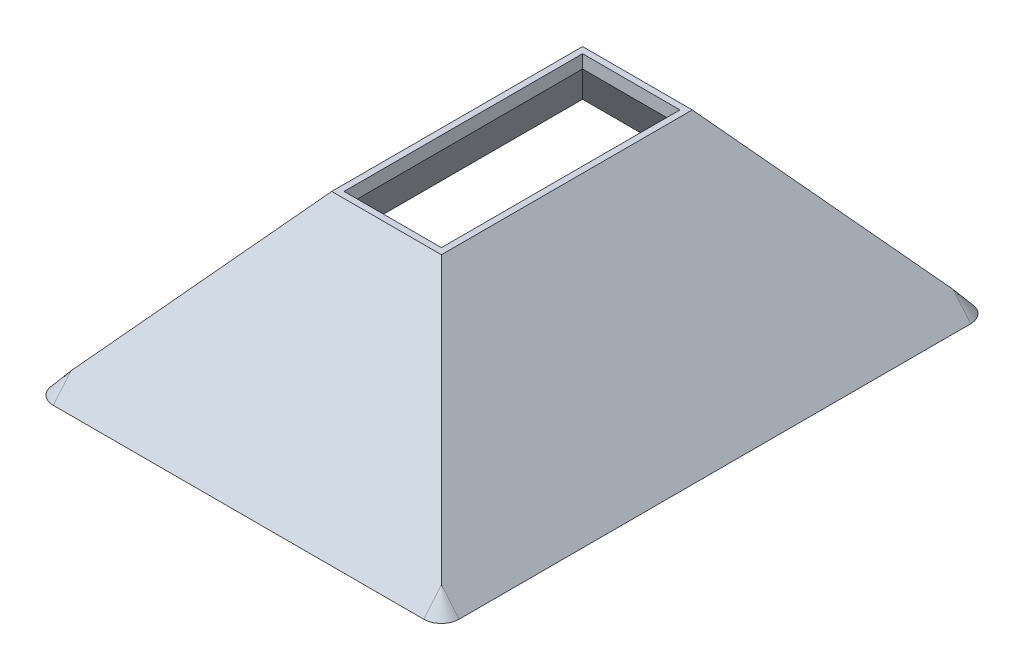
ISO-10303-21;
HEADER;
FILE_DESCRIPTION(('STEP AP214'),'2;1');
FILE_NAME('part.step','',(''),(''),'','','');
FILE_SCHEMA(('AUTOMOTIVE_DESIGN { 1 0 10303 214 1 1 1 1 }'));
ENDSEC;
DATA;
#1=APPLICATION_CONTEXT('core data for automotive mechanical design processes');
#2=APPLICATION_PROTOCOL_DEFINITION('international standard','automotive_design',2000,#1);
#3=PRODUCT_CONTEXT('',#1,'mechanical');
#4=PRODUCT('Part','Part','',(#3));
#5=PRODUCT_RELATED_PRODUCT_CATEGORY('part','',(#4));
#6=PRODUCT_DEFINITION_FORMATION('','',#4);
#7=PRODUCT_DEFINITION_CONTEXT('part definition',#1,'design');
#8=PRODUCT_DEFINITION('design','',#6,#7);
#9=PRODUCT_DEFINITION_SHAPE('','',#8);
#10=(LENGTH_UNIT() NAMED_UNIT(*) SI_UNIT(.MILLI.,.METRE.));
#11=(NAMED_UNIT(*) PLANE_ANGLE_UNIT() SI_UNIT($,.RADIAN.));
#12=(NAMED_UNIT(*) SI_UNIT($,.STERADIAN.) SOLID_ANGLE_UNIT());
#13=UNCERTAINTY_MEASURE_WITH_UNIT(LENGTH_MEASURE(1.E-05),#10,'distance_accuracy_value','');
#14=(GEOMETRIC_REPRESENTATION_CONTEXT(3) GLOBAL_UNCERTAINTY_ASSIGNED_CONTEXT((#13)) GLOBAL_UNIT_ASSIGNED_CONTEXT((#10,
#11,#12)) REPRESENTATION_CONTEXT('',''));
#15=CARTESIAN_POINT('',(0.,0.,0.));
#16=DIRECTION('',(0.,0.,1.));
#17=DIRECTION('',(1.,0.,0.));
#18=AXIS2_PLACEMENT_3D('',#15,#16,#17);
#19=CARTESIAN_POINT('',(0.,0.,0.));
#20=DIRECTION('',(0.,1.,0.));
#21=DIRECTION('',(0.,0.,1.));
#22=AXIS2_PLACEMENT_3D('',#19,#20,#21);
#23=PLANE('',#22);
#24=CARTESIAN_POINT('',(-10.5,0.,-15.25));
#25=DIRECTION('',(0.,1.,0.));
#26=DIRECTION('',(0.,0.,1.));
#27=AXIS2_PLACEMENT_3D('',#24,#25,#26);
#28=CIRCLE('',#27,1.);
#29=CARTESIAN_POINT('',(-11.5,0.,-15.25));
#30=VERTEX_POINT('',#29);
#31=CARTESIAN_POINT('',(-10.5,0.,-16.25));
#32=VERTEX_POINT('',#31);
#33=EDGE_CURVE('E227',#30,#32,#28,.F.);
#34=ORIENTED_EDGE('',*,*,#33,.T.);
#35=DIRECTION('',(1.,0.,0.));
#36=VECTOR('',#35,1.);
#37=CARTESIAN_POINT('',(0.,0.,-16.25));
#38=LINE('',#37,#36);
#39=CARTESIAN_POINT('',(10.5,0.,-16.25));
#40=VERTEX_POINT('',#39);
#41=EDGE_CURVE('E249',#32,#40,#38,.T.);
#42=ORIENTED_EDGE('',*,*,#41,.T.);
#43=CARTESIAN_POINT('',(10.5,0.,-15.25));
#44=DIRECTION('',(0.,1.,0.));
#45=DIRECTION('',(0.,0.,1.));
#46=AXIS2_PLACEMENT_3D('',#43,#44,#45);
#47=CIRCLE('',#46,1.);
#48=CARTESIAN_POINT('',(11.5,0.,-15.25));
#49=VERTEX_POINT('',#48);
#50=EDGE_CURVE('E246',#49,#40,#47,.T.);
#51=ORIENTED_EDGE('',*,*,#50,.F.);
#52=DIRECTION('',(0.,0.,1.));
#53=VECTOR('',#52,1.);
#54=CARTESIAN_POINT('',(11.5,0.,0.));
#55=LINE('',#54,#53);
#56=CARTESIAN_POINT('',(11.5,0.,13.75));
#57=VERTEX_POINT('',#56);
#58=EDGE_CURVE('E243',#49,#57,#55,.T.);
#59=ORIENTED_EDGE('',*,*,#58,.T.);
#60=CARTESIAN_POINT('',(10.5,0.,13.75));
#61=DIRECTION('',(0.,1.,0.));
#62=DIRECTION('',(0.,0.,1.));
#63=AXIS2_PLACEMENT_3D('',#60,#61,#62);
#64=CIRCLE('',#63,1.);
#65=CARTESIAN_POINT('',(10.5,0.,14.75));
#66=VERTEX_POINT('',#65);
#67=EDGE_CURVE('E240',#57,#66,#64,.F.);
#68=ORIENTED_EDGE('',*,*,#67,.T.);
#69=DIRECTION('',(-1.,0.,0.));
#70=VECTOR('',#69,1.);
#71=CARTESIAN_POINT('',(0.,0.,14.75));
#72=LINE('',#71,#70);
#73=CARTESIAN_POINT('',(-10.5,0.,14.75));
#74=VERTEX_POINT('',#73);
#75=EDGE_CURVE('E237',#66,#74,#72,.T.);
#76=ORIENTED_EDGE('',*,*,#75,.T.);
#77=CARTESIAN_POINT('',(-10.5,0.,13.75));
#78=DIRECTION('',(0.,1.,0.));
#79=DIRECTION('',(0.,0.,1.));
#80=AXIS2_PLACEMENT_3D('',#77,#78,#79);
#81=CIRCLE('',#80,1.);
#82=CARTESIAN_POINT('',(-11.5,0.,13.75));
#83=VERTEX_POINT('',#82);
#84=EDGE_CURVE('E234',#83,#74,#81,.T.);
#85=ORIENTED_EDGE('',*,*,#84,.F.);
#86=DIRECTION('',(0.,0.,1.));
#87=VECTOR('',#86,1.);
#88=CARTESIAN_POINT('',(-11.5,0.,0.));
#89=LINE('',#88,#87);
#90=EDGE_CURVE('E230',#30,#83,#89,.T.);
#91=ORIENTED_EDGE('',*,*,#90,.F.);
#92=EDGE_LOOP('',(#34,#42,#51,#59,#68,#76,#85,#91));
#93=FACE_BOUND('',#92,.T.);
#94=CARTESIAN_POINT('',(-10.5,0.,-15.25));
#95=DIRECTION('',(0.,1.,0.));
#96=DIRECTION('',(0.,0.,1.));
#97=AXIS2_PLACEMENT_3D('',#94,#95,#96);
#98=CIRCLE('',#97,0.0209445330007899);
#99=CARTESIAN_POINT('',(-10.5209445330008,0.,-15.25));
#100=VERTEX_POINT('',#99);
#101=CARTESIAN_POINT('',(-10.5,0.,-15.2709445330008));
#102=VERTEX_POINT('',#101);
#103=EDGE_CURVE('E207',#100,#102,#98,.F.);
#104=ORIENTED_EDGE('',*,*,#103,.F.);
#105=DIRECTION('',(0.,0.,-1.));
#106=VECTOR('',#105,1.);
#107=CARTESIAN_POINT('',(-10.5209445330008,0.,0.));
#108=LINE('',#107,#106);
#109=CARTESIAN_POINT('',(-10.5209445330008,0.,13.75));
#110=VERTEX_POINT('',#109);
#111=EDGE_CURVE('E210',#100,#110,#108,.F.);
#112=ORIENTED_EDGE('',*,*,#111,.T.);
#113=CARTESIAN_POINT('',(-10.5,0.,13.75));
#114=DIRECTION('',(0.,1.,0.));
#115=DIRECTION('',(0.,0.,1.));
#116=AXIS2_PLACEMENT_3D('',#113,#114,#115);
#117=CIRCLE('',#116,0.0209445330007908);
#118=CARTESIAN_POINT('',(-10.5,0.,13.7709445330008));
#119=VERTEX_POINT('',#118);
#120=EDGE_CURVE('E58',#110,#119,#117,.T.);
#121=ORIENTED_EDGE('',*,*,#120,.T.);
#122=DIRECTION('',(-1.,0.,0.));
#123=VECTOR('',#122,1.);
#124=CARTESIAN_POINT('',(0.,0.,13.7709445330008));
#125=LINE('',#124,#123);
#126=CARTESIAN_POINT('',(10.5,0.,13.7709445330008));
#127=VERTEX_POINT('',#126);
#128=EDGE_CURVE('E222',#127,#119,#125,.T.);
#129=ORIENTED_EDGE('',*,*,#128,.F.);
#130=CARTESIAN_POINT('',(10.5,0.,13.75));
#131=DIRECTION('',(0.,1.,0.));
#132=DIRECTION('',(0.,0.,1.));
#133=AXIS2_PLACEMENT_3D('',#130,#131,#132);
#134=CIRCLE('',#133,0.0209445330007908);
#135=CARTESIAN_POINT('',(10.5209445330008,0.,13.75));
#136=VERTEX_POINT('',#135);
#137=EDGE_CURVE('E219',#136,#127,#134,.F.);
#138=ORIENTED_EDGE('',*,*,#137,.F.);
#139=DIRECTION('',(0.,0.,1.));
#140=VECTOR('',#139,1.);
#141=CARTESIAN_POINT('',(10.5209445330008,0.,0.));
#142=LINE('',#141,#140);
#143=CARTESIAN_POINT('',(10.5209445330008,0.,-15.25));
#144=VERTEX_POINT('',#143);
#145=EDGE_CURVE('E217',#144,#136,#142,.T.);
#146=ORIENTED_EDGE('',*,*,#145,.F.);
#147=CARTESIAN_POINT('',(10.5,0.,-15.25));
#148=DIRECTION('',(0.,1.,0.));
#149=DIRECTION('',(0.,0.,1.));
#150=AXIS2_PLACEMENT_3D('',#147,#148,#149);
#151=CIRCLE('',#150,0.0209445330007908);
#152=CARTESIAN_POINT('',(10.5,0.,-15.2709445330008));
#153=VERTEX_POINT('',#152);
#154=EDGE_CURVE('E214',#144,#153,#151,.T.);
#155=ORIENTED_EDGE('',*,*,#154,.T.);
#156=DIRECTION('',(1.,0.,0.));
#157=VECTOR('',#156,1.);
#158=CARTESIAN_POINT('',(0.,0.,-15.2709445330008));
#159=LINE('',#158,#157);
#160=EDGE_CURVE('E211',#102,#153,#159,.T.);
#161=ORIENTED_EDGE('',*,*,#160,.F.);
#162=EDGE_LOOP('',(#104,#112,#121,#129,#138,#146,#155,#161));
#163=FACE_BOUND('',#162,.T.);
#164=ADVANCED_FACE('F35',(#93,#163),#23,.F.);
#165=CARTESIAN_POINT('',(-10.5,0.,-15.25));
#166=DIRECTION('',(0.,-1.,0.));
#167=DIRECTION('',(0.,0.,1.));
#168=AXIS2_PLACEMENT_3D('',#165,#166,#167);
#169=CONICAL_SURFACE('',#168,1.,0.698131700797733);
#170=DIRECTION('',(-0.64278760968654,-0.766044443118977,0.));
#171=VECTOR('',#170,1.);
#172=CARTESIAN_POINT('',(-11.5,0.,-15.25));
#173=LINE('',#172,#171);
#174=CARTESIAN_POINT('',(-10.5,1.19175359259421,-15.25));
#175=VERTEX_POINT('',#174);
#176=EDGE_CURVE('E253',#175,#30,#173,.T.);
#177=ORIENTED_EDGE('',*,*,#176,.F.);
#178=DIRECTION('',(0.,-0.766044443118977,-0.64278760968654));
#179=VECTOR('',#178,1.);
#180=CARTESIAN_POINT('',(-10.5,0.,-16.25));
#181=LINE('',#180,#179);
#182=EDGE_CURVE('E257',#175,#32,#181,.T.);
#183=ORIENTED_EDGE('',*,*,#182,.T.);
#184=ORIENTED_EDGE('',*,*,#33,.F.);
#185=EDGE_LOOP('',(#177,#183,#184));
#186=FACE_BOUND('',#185,.T.);
#187=ADVANCED_FACE('F344',(#186),#169,.T.);
#188=CARTESIAN_POINT('',(-11.5,0.,0.));
#189=DIRECTION('',(-0.766044443118977,0.64278760968654,0.));
#190=DIRECTION('',(-0.64278760968654,-0.766044443118977,0.));
#191=AXIS2_PLACEMENT_3D('',#188,#189,#190);
#192=PLANE('',#191);
#193=ORIENTED_EDGE('',*,*,#90,.T.);
#194=DIRECTION('',(-0.64278760968654,-0.766044443118977,0.));
#195=VECTOR('',#194,1.);
#196=CARTESIAN_POINT('',(-11.5,0.,13.75));
#197=LINE('',#196,#195);
#198=CARTESIAN_POINT('',(-10.5,1.19175359259422,13.75));
#199=VERTEX_POINT('',#198);
#200=EDGE_CURVE('E256',#199,#83,#197,.T.);
#201=ORIENTED_EDGE('',*,*,#200,.F.);
#202=DIRECTION('',(0.540716203060937,0.644400477571771,-0.540716203060937));
#203=VECTOR('',#202,1.);
#204=CARTESIAN_POINT('',(-7.1874833192736,5.13945724737813,10.4374833192736));
#205=LINE('',#204,#203);
#206=CARTESIAN_POINT('',(-3.10900368822717,10.,6.35900368822718));
#207=VERTEX_POINT('',#206);
#208=EDGE_CURVE('E274',#207,#199,#205,.F.);
#209=ORIENTED_EDGE('',*,*,#208,.F.);
#210=DIRECTION('',(0.,0.,-1.));
#211=VECTOR('',#210,1.);
#212=CARTESIAN_POINT('',(-3.10900368822717,10.,0.));
#213=LINE('',#212,#211);
#214=CARTESIAN_POINT('',(-3.10900368822717,10.,-7.85900368822718));
#215=VERTEX_POINT('',#214);
#216=EDGE_CURVE('E252',#215,#207,#213,.F.);
#217=ORIENTED_EDGE('',*,*,#216,.F.);
#218=DIRECTION('',(0.540716203060937,0.644400477571771,0.540716203060937));
#219=VECTOR('',#218,1.);
#220=CARTESIAN_POINT('',(-8.13769885909467,4.00703446405752,-12.8876988590947));
#221=LINE('',#220,#219);
#222=EDGE_CURVE('E255',#215,#175,#221,.F.);
#223=ORIENTED_EDGE('',*,*,#222,.T.);
#224=ORIENTED_EDGE('',*,*,#176,.T.);
#225=EDGE_LOOP('',(#193,#201,#209,#217,#223,#224));
#226=FACE_BOUND('',#225,.T.);
#227=ADVANCED_FACE('F37',(#226),#192,.T.);
#228=CARTESIAN_POINT('',(-10.5,0.,13.75));
#229=DIRECTION('',(0.,-1.,0.));
#230=DIRECTION('',(0.,0.,1.));
#231=AXIS2_PLACEMENT_3D('',#228,#229,#230);
#232=CONICAL_SURFACE('',#231,1.,0.698131700797733);
#233=DIRECTION('',(0.,-0.766044443118977,0.64278760968654));
#234=VECTOR('',#233,1.);
#235=CARTESIAN_POINT('',(-10.5,0.,14.75));
#236=LINE('',#235,#234);
#237=EDGE_CURVE('E273',#199,#74,#236,.T.);
#238=ORIENTED_EDGE('',*,*,#237,.F.);
#239=ORIENTED_EDGE('',*,*,#200,.T.);
#240=ORIENTED_EDGE('',*,*,#84,.T.);
#241=EDGE_LOOP('',(#238,#239,#240));
#242=FACE_BOUND('',#241,.T.);
#243=ADVANCED_FACE('F324',(#242),#232,.T.);
#244=CARTESIAN_POINT('',(0.,0.,14.75));
#245=DIRECTION('',(0.,0.64278760968654,0.766044443118977));
#246=DIRECTION('',(0.,-0.766044443118977,0.64278760968654));
#247=AXIS2_PLACEMENT_3D('',#244,#245,#246);
#248=PLANE('',#247);
#249=ORIENTED_EDGE('',*,*,#75,.F.);
#250=DIRECTION('',(0.,-0.766044443118977,0.64278760968654));
#251=VECTOR('',#250,1.);
#252=CARTESIAN_POINT('',(10.5,0.,14.75));
#253=LINE('',#252,#251);
#254=CARTESIAN_POINT('',(10.5,1.19175359259422,13.75));
#255=VERTEX_POINT('',#254);
#256=EDGE_CURVE('E270',#255,#66,#253,.T.);
#257=ORIENTED_EDGE('',*,*,#256,.F.);
#258=DIRECTION('',(0.540716203060937,-0.644400477571771,0.540716203060937));
#259=VECTOR('',#258,1.);
#260=CARTESIAN_POINT('',(7.1874833192736,5.13945724737813,10.4374833192736));
#261=LINE('',#260,#259);
#262=CARTESIAN_POINT('',(3.10900368822718,10.,6.35900368822718));
#263=VERTEX_POINT('',#262);
#264=EDGE_CURVE('E268',#263,#255,#261,.T.);
#265=ORIENTED_EDGE('',*,*,#264,.F.);
#266=DIRECTION('',(-1.,0.,0.));
#267=VECTOR('',#266,1.);
#268=CARTESIAN_POINT('',(0.,10.,6.35900368822718));
#269=LINE('',#268,#267);
#270=EDGE_CURVE('E282',#263,#207,#269,.T.);
#271=ORIENTED_EDGE('',*,*,#270,.T.);
#272=ORIENTED_EDGE('',*,*,#208,.T.);
#273=ORIENTED_EDGE('',*,*,#237,.T.);
#274=EDGE_LOOP('',(#249,#257,#265,#271,#272,#273));
#275=FACE_BOUND('',#274,.T.);
#276=ADVANCED_FACE('F321',(#275),#248,.T.);
#277=CARTESIAN_POINT('',(10.5,0.,13.75));
#278=DIRECTION('',(0.,-1.,0.));
#279=DIRECTION('',(0.,0.,1.));
#280=AXIS2_PLACEMENT_3D('',#277,#278,#279);
#281=CONICAL_SURFACE('',#280,1.,0.698131700797733);
#282=DIRECTION('',(0.64278760968654,-0.766044443118977,0.));
#283=VECTOR('',#282,1.);
#284=CARTESIAN_POINT('',(11.5,0.,13.75));
#285=LINE('',#284,#283);
#286=EDGE_CURVE('E267',#255,#57,#285,.T.);
#287=ORIENTED_EDGE('',*,*,#286,.F.);
#288=ORIENTED_EDGE('',*,*,#256,.T.);
#289=ORIENTED_EDGE('',*,*,#67,.F.);
#290=EDGE_LOOP('',(#287,#288,#289));
#291=FACE_BOUND('',#290,.T.);
#292=ADVANCED_FACE('F333',(#291),#281,.T.);
#293=CARTESIAN_POINT('',(11.5,0.,0.));
#294=DIRECTION('',(0.766044443118977,0.64278760968654,0.));
#295=DIRECTION('',(-0.64278760968654,0.766044443118977,0.));
#296=AXIS2_PLACEMENT_3D('',#293,#294,#295);
#297=PLANE('',#296);
#298=ORIENTED_EDGE('',*,*,#58,.F.);
#299=DIRECTION('',(0.64278760968654,-0.766044443118977,0.));
#300=VECTOR('',#299,1.);
#301=CARTESIAN_POINT('',(11.5,0.,-15.25));
#302=LINE('',#301,#300);
#303=CARTESIAN_POINT('',(10.5,1.19175359259421,-15.25));
#304=VERTEX_POINT('',#303);
#305=EDGE_CURVE('E264',#304,#49,#302,.T.);
#306=ORIENTED_EDGE('',*,*,#305,.F.);
#307=DIRECTION('',(0.540716203060937,-0.644400477571771,-0.540716203060937));
#308=VECTOR('',#307,1.);
#309=CARTESIAN_POINT('',(8.13769885909467,4.00703446405752,-12.8876988590947));
#310=LINE('',#309,#308);
#311=CARTESIAN_POINT('',(3.10900368822717,10.,-7.85900368822718));
#312=VERTEX_POINT('',#311);
#313=EDGE_CURVE('E262',#312,#304,#310,.T.);
#314=ORIENTED_EDGE('',*,*,#313,.F.);
#315=DIRECTION('',(0.,0.,1.));
#316=VECTOR('',#315,1.);
#317=CARTESIAN_POINT('',(3.10900368822717,10.,0.));
#318=LINE('',#317,#316);
#319=EDGE_CURVE('E279',#312,#263,#318,.T.);
#320=ORIENTED_EDGE('',*,*,#319,.T.);
#321=ORIENTED_EDGE('',*,*,#264,.T.);
#322=ORIENTED_EDGE('',*,*,#286,.T.);
#323=EDGE_LOOP('',(#298,#306,#314,#320,#321,#322));
#324=FACE_BOUND('',#323,.T.);
#325=ADVANCED_FACE('F336',(#324),#297,.T.);
#326=CARTESIAN_POINT('',(10.5,0.,-15.25));
#327=DIRECTION('',(0.,-1.,0.));
#328=DIRECTION('',(0.,0.,1.));
#329=AXIS2_PLACEMENT_3D('',#326,#327,#328);
#330=CONICAL_SURFACE('',#329,1.,0.698131700797733);
#331=DIRECTION('',(0.,-0.766044443118977,-0.64278760968654));
#332=VECTOR('',#331,1.);
#333=CARTESIAN_POINT('',(10.5,0.,-16.25));
#334=LINE('',#333,#332);
#335=EDGE_CURVE('E259',#304,#40,#334,.T.);
#336=ORIENTED_EDGE('',*,*,#335,.F.);
#337=ORIENTED_EDGE('',*,*,#305,.T.);
#338=ORIENTED_EDGE('',*,*,#50,.T.);
#339=EDGE_LOOP('',(#336,#337,#338));
#340=FACE_BOUND('',#339,.T.);
#341=ADVANCED_FACE('F340',(#340),#330,.T.);
#342=CARTESIAN_POINT('',(0.,0.,-16.25));
#343=DIRECTION('',(0.,0.64278760968654,-0.766044443118977));
#344=DIRECTION('',(0.,0.766044443118977,0.64278760968654));
#345=AXIS2_PLACEMENT_3D('',#342,#343,#344);
#346=PLANE('',#345);
#347=ORIENTED_EDGE('',*,*,#41,.F.);
#348=ORIENTED_EDGE('',*,*,#182,.F.);
#349=ORIENTED_EDGE('',*,*,#222,.F.);
#350=DIRECTION('',(1.,0.,0.));
#351=VECTOR('',#350,1.);
#352=CARTESIAN_POINT('',(0.,10.,-7.85900368822718));
#353=LINE('',#352,#351);
#354=EDGE_CURVE('E260',#215,#312,#353,.T.);
#355=ORIENTED_EDGE('',*,*,#354,.T.);
#356=ORIENTED_EDGE('',*,*,#313,.T.);
#357=ORIENTED_EDGE('',*,*,#335,.T.);
#358=EDGE_LOOP('',(#347,#348,#349,#355,#356,#357));
#359=FACE_BOUND('',#358,.T.);
#360=ADVANCED_FACE('F305',(#359),#346,.T.);
#361=CARTESIAN_POINT('',(0.,10.,0.));
#362=DIRECTION('',(0.,1.,0.));
#363=DIRECTION('',(0.,0.,1.));
#364=AXIS2_PLACEMENT_3D('',#361,#362,#363);
#365=PLANE('',#364);
#366=DIRECTION('',(0.,0.,-1.));
#367=VECTOR('',#366,1.);
#368=CARTESIAN_POINT('',(2.75927294461092,10.,0.));
#369=LINE('',#368,#367);
#370=CARTESIAN_POINT('',(2.75927294461092,10.,6.00927294461093));
#371=VERTEX_POINT('',#370);
#372=CARTESIAN_POINT('',(2.75927294461092,10.,-7.50927294461093));
#373=VERTEX_POINT('',#372);
#374=EDGE_CURVE('E11',#371,#373,#369,.T.);
#375=ORIENTED_EDGE('',*,*,#374,.F.);
#376=DIRECTION('',(1.,0.,0.));
#377=VECTOR('',#376,1.);
#378=CARTESIAN_POINT('',(0.,10.,6.00927294461093));
#379=LINE('',#378,#377);
#380=CARTESIAN_POINT('',(-2.75927294461093,10.,6.00927294461093));
#381=VERTEX_POINT('',#380);
#382=EDGE_CURVE('E164',#381,#371,#379,.T.);
#383=ORIENTED_EDGE('',*,*,#382,.F.);
#384=DIRECTION('',(0.,0.,1.));
#385=VECTOR('',#384,1.);
#386=CARTESIAN_POINT('',(-2.75927294461093,10.,0.));
#387=LINE('',#386,#385);
#388=CARTESIAN_POINT('',(-2.75927294461093,10.,-7.50927294461093));
#389=VERTEX_POINT('',#388);
#390=EDGE_CURVE('E287',#389,#381,#387,.T.);
#391=ORIENTED_EDGE('',*,*,#390,.F.);
#392=DIRECTION('',(-1.,0.,0.));
#393=VECTOR('',#392,1.);
#394=CARTESIAN_POINT('',(0.,10.,-7.50927294461093));
#395=LINE('',#394,#393);
#396=EDGE_CURVE('E43',#373,#389,#395,.T.);
#397=ORIENTED_EDGE('',*,*,#396,.F.);
#398=EDGE_LOOP('',(#375,#383,#391,#397));
#399=FACE_BOUND('',#398,.T.);
#400=ORIENTED_EDGE('',*,*,#354,.F.);
#401=ORIENTED_EDGE('',*,*,#216,.T.);
#402=ORIENTED_EDGE('',*,*,#270,.F.);
#403=ORIENTED_EDGE('',*,*,#319,.F.);
#404=EDGE_LOOP('',(#400,#401,#402,#403));
#405=FACE_BOUND('',#404,.T.);
#406=ADVANCED_FACE('F301',(#399,#405),#365,.T.);
#407=CARTESIAN_POINT('',(-10.5,-0.482090707264905,-15.25));
#408=DIRECTION('',(0.,-1.,0.));
#409=DIRECTION('',(0.,0.,1.));
#410=AXIS2_PLACEMENT_3D('',#407,#408,#409);
#411=CONICAL_SURFACE('',#410,0.425466667660767,0.698131700797733);
#412=DIRECTION('',(-0.64278760968654,-0.766044443118977,0.));
#413=VECTOR('',#412,1.);
#414=CARTESIAN_POINT('',(-10.9254666676608,-0.482090707264905,-15.25));
#415=LINE('',#414,#413);
#416=CARTESIAN_POINT('',(-10.5,0.0249607224488983,-15.25));
#417=VERTEX_POINT('',#416);
#418=EDGE_CURVE('E557',#417,#100,#415,.T.);
#419=ORIENTED_EDGE('',*,*,#418,.T.);
#420=ORIENTED_EDGE('',*,*,#103,.T.);
#421=DIRECTION('',(0.,-0.766044443118977,-0.64278760968654));
#422=VECTOR('',#421,1.);
#423=CARTESIAN_POINT('',(-10.5,-0.482090707264905,-15.6754666676608));
#424=LINE('',#423,#422);
#425=EDGE_CURVE('E205',#417,#102,#424,.T.);
#426=ORIENTED_EDGE('',*,*,#425,.F.);
#427=EDGE_LOOP('',(#419,#420,#426));
#428=FACE_BOUND('',#427,.T.);
#429=ADVANCED_FACE('F304',(#428),#411,.F.);
#430=CARTESIAN_POINT('',(-10.9254666676608,-0.482090707264905,0.));
#431=DIRECTION('',(-0.766044443118977,0.64278760968654,0.));
#432=DIRECTION('',(-0.64278760968654,-0.766044443118977,0.));
#433=AXIS2_PLACEMENT_3D('',#430,#431,#432);
#434=PLANE('',#433);
#435=ORIENTED_EDGE('',*,*,#111,.F.);
#436=ORIENTED_EDGE('',*,*,#418,.F.);
#437=DIRECTION('',(0.540716203060937,0.644400477571771,0.540716203060937));
#438=VECTOR('',#437,1.);
#439=CARTESIAN_POINT('',(-7.73114414230434,3.32475463823321,-12.4811441423043));
#440=LINE('',#439,#438);
#441=CARTESIAN_POINT('',(-2.75927294461093,9.25,-7.50927294461093));
#442=VERTEX_POINT('',#441);
#443=EDGE_CURVE('E231',#442,#417,#440,.F.);
#444=ORIENTED_EDGE('',*,*,#443,.F.);
#445=DIRECTION('',(0.,0.,-1.));
#446=VECTOR('',#445,1.);
#447=CARTESIAN_POINT('',(-2.75927294461093,9.25,0.));
#448=LINE('',#447,#446);
#449=CARTESIAN_POINT('',(-2.75927294461093,9.25,6.00927294461093));
#450=VERTEX_POINT('',#449);
#451=EDGE_CURVE('E186',#442,#450,#448,.F.);
#452=ORIENTED_EDGE('',*,*,#451,.T.);
#453=DIRECTION('',(0.540716203060937,0.644400477571771,-0.540716203060937));
#454=VECTOR('',#453,1.);
#455=CARTESIAN_POINT('',(-6.78092860248327,4.45717742155382,10.0309286024833));
#456=LINE('',#455,#454);
#457=CARTESIAN_POINT('',(-10.5,0.0249607224489009,13.75));
#458=VERTEX_POINT('',#457);
#459=EDGE_CURVE('E185',#450,#458,#456,.F.);
#460=ORIENTED_EDGE('',*,*,#459,.T.);
#461=DIRECTION('',(-0.64278760968654,-0.766044443118977,0.));
#462=VECTOR('',#461,1.);
#463=CARTESIAN_POINT('',(-10.9254666676608,-0.482090707264905,13.75));
#464=LINE('',#463,#462);
#465=EDGE_CURVE('E559',#458,#110,#464,.T.);
#466=ORIENTED_EDGE('',*,*,#465,.T.);
#467=EDGE_LOOP('',(#435,#436,#444,#452,#460,#466));
#468=FACE_BOUND('',#467,.T.);
#469=ADVANCED_FACE('F400',(#468),#434,.F.);
#470=CARTESIAN_POINT('',(-10.5,-0.482090707264905,13.75));
#471=DIRECTION('',(0.,-1.,0.));
#472=DIRECTION('',(0.,0.,1.));
#473=AXIS2_PLACEMENT_3D('',#470,#471,#472);
#474=CONICAL_SURFACE('',#473,0.425466667660768,0.698131700797733);
#475=DIRECTION('',(0.,-0.766044443118977,0.64278760968654));
#476=VECTOR('',#475,1.);
#477=CARTESIAN_POINT('',(-10.5,-0.482090707264905,14.1754666676608));
#478=LINE('',#477,#476);
#479=EDGE_CURVE('E194',#458,#119,#478,.T.);
#480=ORIENTED_EDGE('',*,*,#479,.T.);
#481=ORIENTED_EDGE('',*,*,#120,.F.);
#482=ORIENTED_EDGE('',*,*,#465,.F.);
#483=EDGE_LOOP('',(#480,#481,#482));
#484=FACE_BOUND('',#483,.T.);
#485=ADVANCED_FACE('F408',(#484),#474,.F.);
#486=CARTESIAN_POINT('',(0.,-0.482090707264905,14.1754666676608));
#487=DIRECTION('',(0.,0.64278760968654,0.766044443118977));
#488=DIRECTION('',(0.,-0.766044443118977,0.64278760968654));
#489=AXIS2_PLACEMENT_3D('',#486,#487,#488);
#490=PLANE('',#489);
#491=ORIENTED_EDGE('',*,*,#128,.T.);
#492=ORIENTED_EDGE('',*,*,#479,.F.);
#493=ORIENTED_EDGE('',*,*,#459,.F.);
#494=DIRECTION('',(-1.,0.,0.));
#495=VECTOR('',#494,1.);
#496=CARTESIAN_POINT('',(0.,9.25,6.00927294461093));
#497=LINE('',#496,#495);
#498=CARTESIAN_POINT('',(2.75927294461092,9.25,6.00927294461093));
#499=VERTEX_POINT('',#498);
#500=EDGE_CURVE('E162',#499,#450,#497,.T.);
#501=ORIENTED_EDGE('',*,*,#500,.F.);
#502=DIRECTION('',(0.540716203060937,-0.644400477571771,0.540716203060937));
#503=VECTOR('',#502,1.);
#504=CARTESIAN_POINT('',(6.78092860248327,4.45717742155382,10.0309286024833));
#505=LINE('',#504,#503);
#506=CARTESIAN_POINT('',(10.5,0.0249607224489008,13.75));
#507=VERTEX_POINT('',#506);
#508=EDGE_CURVE('E182',#499,#507,#505,.T.);
#509=ORIENTED_EDGE('',*,*,#508,.T.);
#510=DIRECTION('',(0.,-0.766044443118977,0.64278760968654));
#511=VECTOR('',#510,1.);
#512=CARTESIAN_POINT('',(10.5,-0.482090707264905,14.1754666676608));
#513=LINE('',#512,#511);
#514=EDGE_CURVE('E192',#507,#127,#513,.T.);
#515=ORIENTED_EDGE('',*,*,#514,.T.);
#516=EDGE_LOOP('',(#491,#492,#493,#501,#509,#515));
#517=FACE_BOUND('',#516,.T.);
#518=ADVANCED_FACE('F181',(#517),#490,.F.);
#519=CARTESIAN_POINT('',(10.5,-0.482090707264905,13.75));
#520=DIRECTION('',(0.,-1.,0.));
#521=DIRECTION('',(0.,0.,1.));
#522=AXIS2_PLACEMENT_3D('',#519,#520,#521);
#523=CONICAL_SURFACE('',#522,0.425466667660768,0.698131700797733);
#524=DIRECTION('',(-0.64278760968654,0.766044443118977,0.));
#525=VECTOR('',#524,1.);
#526=CARTESIAN_POINT('',(10.9254666676608,-0.482090707264904,13.75));
#527=LINE('',#526,#525);
#528=EDGE_CURVE('E190',#507,#136,#527,.F.);
#529=ORIENTED_EDGE('',*,*,#528,.T.);
#530=ORIENTED_EDGE('',*,*,#137,.T.);
#531=ORIENTED_EDGE('',*,*,#514,.F.);
#532=EDGE_LOOP('',(#529,#530,#531));
#533=FACE_BOUND('',#532,.T.);
#534=ADVANCED_FACE('F422',(#533),#523,.F.);
#535=CARTESIAN_POINT('',(10.9254666676608,-0.482090707264905,0.));
#536=DIRECTION('',(0.766044443118977,0.64278760968654,0.));
#537=DIRECTION('',(-0.64278760968654,0.766044443118977,0.));
#538=AXIS2_PLACEMENT_3D('',#535,#536,#537);
#539=PLANE('',#538);
#540=ORIENTED_EDGE('',*,*,#145,.T.);
#541=ORIENTED_EDGE('',*,*,#528,.F.);
#542=ORIENTED_EDGE('',*,*,#508,.F.);
#543=DIRECTION('',(0.,0.,1.));
#544=VECTOR('',#543,1.);
#545=CARTESIAN_POINT('',(2.75927294461093,9.25,0.));
#546=LINE('',#545,#544);
#547=CARTESIAN_POINT('',(2.75927294461092,9.25,-7.50927294461093));
#548=VERTEX_POINT('',#547);
#549=EDGE_CURVE('E169',#548,#499,#546,.T.);
#550=ORIENTED_EDGE('',*,*,#549,.F.);
#551=DIRECTION('',(0.540716203060937,-0.644400477571771,-0.540716203060937));
#552=VECTOR('',#551,1.);
#553=CARTESIAN_POINT('',(7.73114414230434,3.32475463823321,-12.4811441423043));
#554=LINE('',#553,#552);
#555=CARTESIAN_POINT('',(10.5,0.0249607224488984,-15.25));
#556=VERTEX_POINT('',#555);
#557=EDGE_CURVE('E201',#548,#556,#554,.T.);
#558=ORIENTED_EDGE('',*,*,#557,.T.);
#559=DIRECTION('',(0.64278760968654,-0.766044443118977,0.));
#560=VECTOR('',#559,1.);
#561=CARTESIAN_POINT('',(10.9254666676608,-0.482090707264905,-15.25));
#562=LINE('',#561,#560);
#563=EDGE_CURVE('E196',#556,#144,#562,.T.);
#564=ORIENTED_EDGE('',*,*,#563,.T.);
#565=EDGE_LOOP('',(#540,#541,#542,#550,#558,#564));
#566=FACE_BOUND('',#565,.T.);
#567=ADVANCED_FACE('F189',(#566),#539,.F.);
#568=CARTESIAN_POINT('',(10.5,-0.482090707264905,-15.25));
#569=DIRECTION('',(0.,-1.,0.));
#570=DIRECTION('',(0.,0.,1.));
#571=AXIS2_PLACEMENT_3D('',#568,#569,#570);
#572=CONICAL_SURFACE('',#571,0.425466667660768,0.698131700797733);
#573=DIRECTION('',(0.,0.766044443118977,0.64278760968654));
#574=VECTOR('',#573,1.);
#575=CARTESIAN_POINT('',(10.5,-0.482090707264905,-15.6754666676608));
#576=LINE('',#575,#574);
#577=EDGE_CURVE('E202',#556,#153,#576,.F.);
#578=ORIENTED_EDGE('',*,*,#577,.T.);
#579=ORIENTED_EDGE('',*,*,#154,.F.);
#580=ORIENTED_EDGE('',*,*,#563,.F.);
#581=EDGE_LOOP('',(#578,#579,#580));
#582=FACE_BOUND('',#581,.T.);
#583=ADVANCED_FACE('F435',(#582),#572,.F.);
#584=CARTESIAN_POINT('',(0.,-0.482090707264905,-15.6754666676608));
#585=DIRECTION('',(0.,0.64278760968654,-0.766044443118977));
#586=DIRECTION('',(0.,0.766044443118977,0.64278760968654));
#587=AXIS2_PLACEMENT_3D('',#584,#585,#586);
#588=PLANE('',#587);
#589=ORIENTED_EDGE('',*,*,#160,.T.);
#590=ORIENTED_EDGE('',*,*,#577,.F.);
#591=ORIENTED_EDGE('',*,*,#557,.F.);
#592=DIRECTION('',(1.,0.,0.));
#593=VECTOR('',#592,1.);
#594=CARTESIAN_POINT('',(0.,9.25,-7.50927294461093));
#595=LINE('',#594,#593);
#596=EDGE_CURVE('E176',#442,#548,#595,.T.);
#597=ORIENTED_EDGE('',*,*,#596,.F.);
#598=ORIENTED_EDGE('',*,*,#443,.T.);
#599=ORIENTED_EDGE('',*,*,#425,.T.);
#600=EDGE_LOOP('',(#589,#590,#591,#597,#598,#599));
#601=FACE_BOUND('',#600,.T.);
#602=ADVANCED_FACE('F442',(#601),#588,.F.);
#603=CARTESIAN_POINT('',(2.75927294461092,19.25,-7.50927294461093));
#604=DIRECTION('',(1.,0.,0.));
#605=DIRECTION('',(0.,0.,-1.));
#606=AXIS2_PLACEMENT_3D('',#603,#604,#605);
#607=PLANE('',#606);
#608=ORIENTED_EDGE('',*,*,#374,.T.);
#609=DIRECTION('',(0.,-1.,0.));
#610=VECTOR('',#609,1.);
#611=CARTESIAN_POINT('',(2.75927294461092,19.25,-7.50927294461093));
#612=LINE('',#611,#610);
#613=EDGE_CURVE('E172',#373,#548,#612,.T.);
#614=ORIENTED_EDGE('',*,*,#613,.T.);
#615=ORIENTED_EDGE('',*,*,#549,.T.);
#616=DIRECTION('',(0.,-1.,0.));
#617=VECTOR('',#616,1.);
#618=CARTESIAN_POINT('',(2.75927294461092,19.25,6.00927294461093));
#619=LINE('',#618,#617);
#620=EDGE_CURVE('E158',#371,#499,#619,.T.);
#621=ORIENTED_EDGE('',*,*,#620,.F.);
#622=EDGE_LOOP('',(#608,#614,#615,#621));
#623=FACE_BOUND('',#622,.T.);
#624=ADVANCED_FACE('F170',(#623),#607,.F.);
#625=CARTESIAN_POINT('',(2.75927294461092,19.25,-7.50927294461093));
#626=DIRECTION('',(0.,0.,-1.));
#627=DIRECTION('',(-1.,0.,0.));
#628=AXIS2_PLACEMENT_3D('',#625,#626,#627);
#629=PLANE('',#628);
#630=ORIENTED_EDGE('',*,*,#396,.T.);
#631=DIRECTION('',(0.,-1.,0.));
#632=VECTOR('',#631,1.);
#633=CARTESIAN_POINT('',(-2.75927294461093,19.25,-7.50927294461093));
#634=LINE('',#633,#632);
#635=EDGE_CURVE('E292',#389,#442,#634,.T.);
#636=ORIENTED_EDGE('',*,*,#635,.T.);
#637=ORIENTED_EDGE('',*,*,#596,.T.);
#638=ORIENTED_EDGE('',*,*,#613,.F.);
#639=EDGE_LOOP('',(#630,#636,#637,#638));
#640=FACE_BOUND('',#639,.T.);
#641=ADVANCED_FACE('F291',(#640),#629,.F.);
#642=CARTESIAN_POINT('',(-2.75927294461093,19.25,-7.50927294461093));
#643=DIRECTION('',(-1.,0.,0.));
#644=DIRECTION('',(0.,0.,1.));
#645=AXIS2_PLACEMENT_3D('',#642,#643,#644);
#646=PLANE('',#645);
#647=ORIENTED_EDGE('',*,*,#390,.T.);
#648=DIRECTION('',(0.,-1.,0.));
#649=VECTOR('',#648,1.);
#650=CARTESIAN_POINT('',(-2.75927294461093,19.25,6.00927294461093));
#651=LINE('',#650,#649);
#652=EDGE_CURVE('E50',#381,#450,#651,.T.);
#653=ORIENTED_EDGE('',*,*,#652,.T.);
#654=ORIENTED_EDGE('',*,*,#451,.F.);
#655=ORIENTED_EDGE('',*,*,#635,.F.);
#656=EDGE_LOOP('',(#647,#653,#654,#655));
#657=FACE_BOUND('',#656,.T.);
#658=ADVANCED_FACE('F297',(#657),#646,.F.);
#659=CARTESIAN_POINT('',(2.75927294461092,19.25,6.00927294461093));
#660=DIRECTION('',(0.,0.,1.));
#661=DIRECTION('',(1.,0.,0.));
#662=AXIS2_PLACEMENT_3D('',#659,#660,#661);
#663=PLANE('',#662);
#664=ORIENTED_EDGE('',*,*,#382,.T.);
#665=ORIENTED_EDGE('',*,*,#620,.T.);
#666=ORIENTED_EDGE('',*,*,#500,.T.);
#667=ORIENTED_EDGE('',*,*,#652,.F.);
#668=EDGE_LOOP('',(#664,#665,#666,#667));
#669=FACE_BOUND('',#668,.T.);
#670=ADVANCED_FACE('F160',(#669),#663,.F.);
#671=CLOSED_SHELL('',(#164,#187,#227,#243,#276,#292,#325,#341,#360,#406,#429,#469,#485,#518,
#534,#567,#583,#602,#624,#641,#658,#670));
#672=MANIFOLD_SOLID_BREP('B2',#671);
#673=ADVANCED_BREP_SHAPE_REPRESENTATION('',(#18,#672),#14);
#674=SHAPE_DEFINITION_REPRESENTATION(#9,#673);
ENDSEC;
END-ISO-10303-21;
